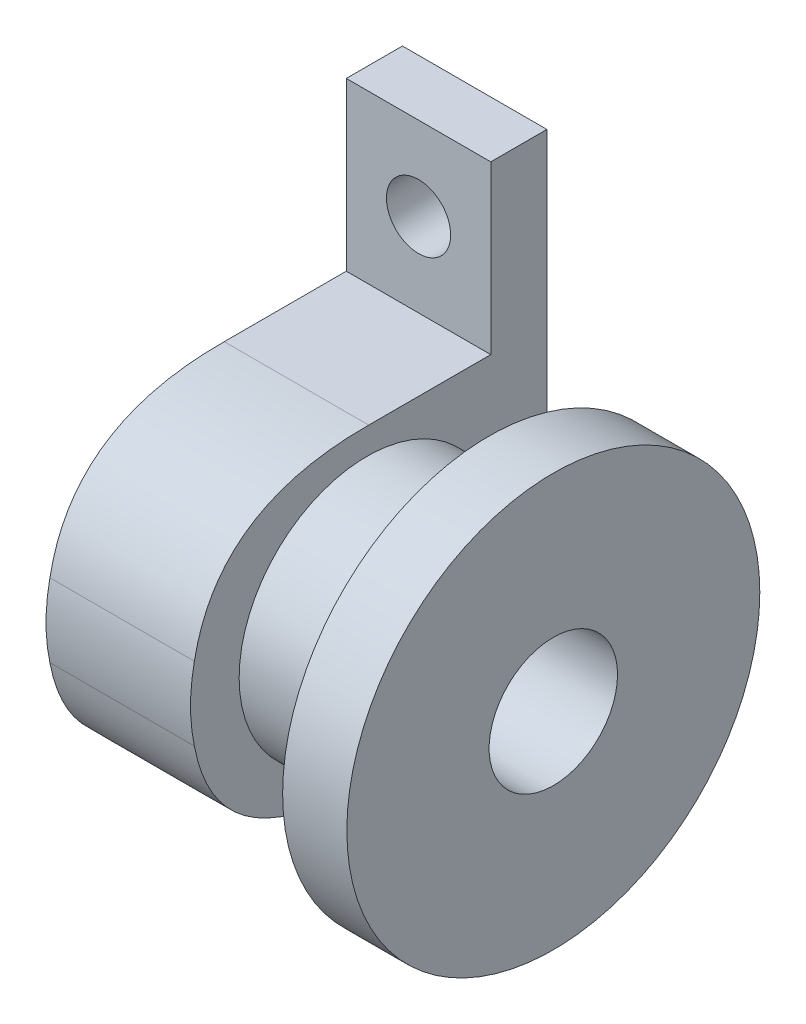
ISO-10303-21;
HEADER;
FILE_DESCRIPTION(('STEP AP214'),'2;1');
FILE_NAME('part.step','',(''),(''),'','','');
FILE_SCHEMA(('AUTOMOTIVE_DESIGN { 1 0 10303 214 1 1 1 1 }'));
ENDSEC;
DATA;
#1=APPLICATION_CONTEXT('core data for automotive mechanical design processes');
#2=APPLICATION_PROTOCOL_DEFINITION('international standard','automotive_design',2000,#1);
#3=PRODUCT_CONTEXT('',#1,'mechanical');
#4=PRODUCT('Part','Part','',(#3));
#5=PRODUCT_RELATED_PRODUCT_CATEGORY('part','',(#4));
#6=PRODUCT_DEFINITION_FORMATION('','',#4);
#7=PRODUCT_DEFINITION_CONTEXT('part definition',#1,'design');
#8=PRODUCT_DEFINITION('design','',#6,#7);
#9=PRODUCT_DEFINITION_SHAPE('','',#8);
#10=(LENGTH_UNIT() NAMED_UNIT(*) SI_UNIT(.MILLI.,.METRE.));
#11=(NAMED_UNIT(*) PLANE_ANGLE_UNIT() SI_UNIT($,.RADIAN.));
#12=(NAMED_UNIT(*) SI_UNIT($,.STERADIAN.) SOLID_ANGLE_UNIT());
#13=UNCERTAINTY_MEASURE_WITH_UNIT(LENGTH_MEASURE(1.E-05),#10,'distance_accuracy_value','');
#14=(GEOMETRIC_REPRESENTATION_CONTEXT(3) GLOBAL_UNCERTAINTY_ASSIGNED_CONTEXT((#13)) GLOBAL_UNIT_ASSIGNED_CONTEXT((#10,
#11,#12)) REPRESENTATION_CONTEXT('',''));
#15=CARTESIAN_POINT('',(0.,0.,0.));
#16=DIRECTION('',(0.,0.,1.));
#17=DIRECTION('',(1.,0.,0.));
#18=AXIS2_PLACEMENT_3D('',#15,#16,#17);
#19=CARTESIAN_POINT('',(0.,-50.,55.5));
#20=DIRECTION('',(1.,0.,0.));
#21=DIRECTION('',(0.,0.,-1.));
#22=AXIS2_PLACEMENT_3D('',#19,#20,#21);
#23=PLANE('',#22);
#24=CARTESIAN_POINT('',(0.,0.,28.));
#25=DIRECTION('',(1.,0.,0.));
#26=DIRECTION('',(0.,0.,-1.));
#27=AXIS2_PLACEMENT_3D('',#24,#25,#26);
#28=CIRCLE('',#27,12.);
#29=CARTESIAN_POINT('',(0.,0.,16.));
#30=VERTEX_POINT('',#29);
#31=EDGE_CURVE('E149',#30,#30,#28,.F.);
#32=ORIENTED_EDGE('',*,*,#31,.F.);
#33=EDGE_LOOP('',(#32));
#34=FACE_BOUND('',#33,.T.);
#35=DIRECTION('',(0.,-1.,0.));
#36=VECTOR('',#35,1.);
#37=CARTESIAN_POINT('',(0.,0.,8.7420219719353));
#38=LINE('',#37,#36);
#39=CARTESIAN_POINT('',(0.,-24.,8.7420219719353));
#40=VERTEX_POINT('',#39);
#41=CARTESIAN_POINT('',(0.,-50.,8.7420219719353));
#42=VERTEX_POINT('',#41);
#43=EDGE_CURVE('E239',#40,#42,#38,.T.);
#44=ORIENTED_EDGE('',*,*,#43,.F.);
#45=DIRECTION('',(0.,0.,1.));
#46=VECTOR('',#45,1.);
#47=CARTESIAN_POINT('',(0.,-24.,0.));
#48=LINE('',#47,#46);
#49=CARTESIAN_POINT('',(0.,-24.,27.75));
#50=VERTEX_POINT('',#49);
#51=EDGE_CURVE('E240',#40,#50,#48,.T.);
#52=ORIENTED_EDGE('',*,*,#51,.T.);
#53=CARTESIAN_POINT('',(0.,0.,55.5));
#54=CARTESIAN_POINT('',(0.,-24.2004229019263,54.7772443116088));
#55=CARTESIAN_POINT('',(0.,-24.,27.75));
#56=B_SPLINE_CURVE_WITH_KNOTS('',2,(#53,#54,#55),.UNSPECIFIED.,.F.,.F.,(3,3),(0.,1.),.UNSPECIFIED.);
#57=CARTESIAN_POINT('',(0.,-5.7193299361362,54.898685192433));
#58=VERTEX_POINT('',#57);
#59=EDGE_CURVE('E227',#58,#50,#56,.T.);
#60=ORIENTED_EDGE('',*,*,#59,.F.);
#61=CARTESIAN_POINT('',(0.,0.,28.));
#62=DIRECTION('',(1.,0.,0.));
#63=DIRECTION('',(0.,0.,-1.));
#64=AXIS2_PLACEMENT_3D('',#61,#62,#63);
#65=CIRCLE('',#64,27.5);
#66=CARTESIAN_POINT('',(0.,5.71932993613605,54.8986851924331));
#67=VERTEX_POINT('',#66);
#68=EDGE_CURVE('E300',#67,#58,#65,.T.);
#69=ORIENTED_EDGE('',*,*,#68,.F.);
#70=CARTESIAN_POINT('',(0.,0.,55.5));
#71=CARTESIAN_POINT('',(0.,24.2004229019263,54.7772443116088));
#72=CARTESIAN_POINT('',(0.,24.,27.75));
#73=B_SPLINE_CURVE_WITH_KNOTS('',2,(#70,#71,#72),.UNSPECIFIED.,.F.,.F.,(3,3),(0.,1.),.UNSPECIFIED.);
#74=CARTESIAN_POINT('',(0.,24.,27.75));
#75=VERTEX_POINT('',#74);
#76=EDGE_CURVE('E292',#67,#75,#73,.T.);
#77=ORIENTED_EDGE('',*,*,#76,.T.);
#78=DIRECTION('',(0.,0.,1.));
#79=VECTOR('',#78,1.);
#80=CARTESIAN_POINT('',(0.,24.,0.));
#81=LINE('',#80,#79);
#82=CARTESIAN_POINT('',(0.,24.,8.7420219719353));
#83=VERTEX_POINT('',#82);
#84=EDGE_CURVE('E301',#83,#75,#81,.T.);
#85=ORIENTED_EDGE('',*,*,#84,.F.);
#86=DIRECTION('',(0.,1.,0.));
#87=VECTOR('',#86,1.);
#88=CARTESIAN_POINT('',(0.,0.,8.7420219719353));
#89=LINE('',#88,#87);
#90=CARTESIAN_POINT('',(0.,50.,8.7420219719353));
#91=VERTEX_POINT('',#90);
#92=EDGE_CURVE('E399',#83,#91,#89,.T.);
#93=ORIENTED_EDGE('',*,*,#92,.T.);
#94=DIRECTION('',(0.,0.,-1.));
#95=VECTOR('',#94,1.);
#96=CARTESIAN_POINT('',(0.,50.,55.5));
#97=LINE('',#96,#95);
#98=CARTESIAN_POINT('',(0.,50.,0.));
#99=VERTEX_POINT('',#98);
#100=EDGE_CURVE('E329',#91,#99,#97,.T.);
#101=ORIENTED_EDGE('',*,*,#100,.T.);
#102=DIRECTION('',(0.,-1.,0.));
#103=VECTOR('',#102,1.);
#104=CARTESIAN_POINT('',(0.,-50.,0.));
#105=LINE('',#104,#103);
#106=CARTESIAN_POINT('',(0.,-50.,0.));
#107=VERTEX_POINT('',#106);
#108=EDGE_CURVE('E312',#99,#107,#105,.T.);
#109=ORIENTED_EDGE('',*,*,#108,.T.);
#110=DIRECTION('',(0.,0.,-1.));
#111=VECTOR('',#110,1.);
#112=CARTESIAN_POINT('',(0.,-50.,55.5));
#113=LINE('',#112,#111);
#114=EDGE_CURVE('E327',#42,#107,#113,.T.);
#115=ORIENTED_EDGE('',*,*,#114,.F.);
#116=EDGE_LOOP('',(#44,#52,#60,#69,#77,#85,#93,#101,#109,#115));
#117=FACE_BOUND('',#116,.T.);
#118=ADVANCED_FACE('F145',(#34,#117),#23,.F.);
#119=CARTESIAN_POINT('',(22.5,-50.,55.5));
#120=DIRECTION('',(-1.,0.,0.));
#121=DIRECTION('',(0.,0.,1.));
#122=AXIS2_PLACEMENT_3D('',#119,#120,#121);
#123=PLANE('',#122);
#124=CARTESIAN_POINT('',(22.5,0.,28.));
#125=DIRECTION('',(1.,0.,0.));
#126=DIRECTION('',(0.,0.,-1.));
#127=AXIS2_PLACEMENT_3D('',#124,#125,#126);
#128=CIRCLE('',#127,19.9273838433925);
#129=CARTESIAN_POINT('',(22.5,0.,8.0726161566075));
#130=VERTEX_POINT('',#129);
#131=EDGE_CURVE('E12',#130,#130,#128,.T.);
#132=ORIENTED_EDGE('',*,*,#131,.F.);
#133=EDGE_LOOP('',(#132));
#134=FACE_BOUND('',#133,.T.);
#135=DIRECTION('',(0.,-1.,0.));
#136=VECTOR('',#135,1.);
#137=CARTESIAN_POINT('',(22.5,0.,8.7420219719353));
#138=LINE('',#137,#136);
#139=CARTESIAN_POINT('',(22.5,-24.,8.7420219719353));
#140=VERTEX_POINT('',#139);
#141=CARTESIAN_POINT('',(22.5,-50.,8.7420219719353));
#142=VERTEX_POINT('',#141);
#143=EDGE_CURVE('E253',#140,#142,#138,.T.);
#144=ORIENTED_EDGE('',*,*,#143,.T.);
#145=DIRECTION('',(0.,0.,-1.));
#146=VECTOR('',#145,1.);
#147=CARTESIAN_POINT('',(22.5,-50.,55.5));
#148=LINE('',#147,#146);
#149=CARTESIAN_POINT('',(22.5,-50.,0.));
#150=VERTEX_POINT('',#149);
#151=EDGE_CURVE('E169',#142,#150,#148,.T.);
#152=ORIENTED_EDGE('',*,*,#151,.T.);
#153=DIRECTION('',(0.,1.,0.));
#154=VECTOR('',#153,1.);
#155=CARTESIAN_POINT('',(22.5,-50.,0.));
#156=LINE('',#155,#154);
#157=CARTESIAN_POINT('',(22.5,50.,0.));
#158=VERTEX_POINT('',#157);
#159=EDGE_CURVE('E320',#150,#158,#156,.T.);
#160=ORIENTED_EDGE('',*,*,#159,.T.);
#161=DIRECTION('',(0.,0.,-1.));
#162=VECTOR('',#161,1.);
#163=CARTESIAN_POINT('',(22.5,50.,55.5));
#164=LINE('',#163,#162);
#165=CARTESIAN_POINT('',(22.5,50.,8.7420219719353));
#166=VERTEX_POINT('',#165);
#167=EDGE_CURVE('E162',#166,#158,#164,.T.);
#168=ORIENTED_EDGE('',*,*,#167,.F.);
#169=DIRECTION('',(0.,1.,0.));
#170=VECTOR('',#169,1.);
#171=CARTESIAN_POINT('',(22.5,0.,8.7420219719353));
#172=LINE('',#171,#170);
#173=CARTESIAN_POINT('',(22.5,24.,8.7420219719353));
#174=VERTEX_POINT('',#173);
#175=EDGE_CURVE('E308',#174,#166,#172,.T.);
#176=ORIENTED_EDGE('',*,*,#175,.F.);
#177=DIRECTION('',(0.,0.,1.));
#178=VECTOR('',#177,1.);
#179=CARTESIAN_POINT('',(22.5,24.,0.));
#180=LINE('',#179,#178);
#181=CARTESIAN_POINT('',(22.5,24.,27.75));
#182=VERTEX_POINT('',#181);
#183=EDGE_CURVE('E376',#174,#182,#180,.T.);
#184=ORIENTED_EDGE('',*,*,#183,.T.);
#185=CARTESIAN_POINT('',(22.5,0.,55.5));
#186=CARTESIAN_POINT('',(22.5,24.2004229019263,54.7772443116088));
#187=CARTESIAN_POINT('',(22.5,24.,27.75));
#188=B_SPLINE_CURVE_WITH_KNOTS('',2,(#185,#186,#187),.UNSPECIFIED.,.F.,.F.,(3,3),(0.,1.),.UNSPECIFIED.);
#189=CARTESIAN_POINT('',(22.5,5.71932993613605,54.8986851924331));
#190=VERTEX_POINT('',#189);
#191=EDGE_CURVE('E407',#190,#182,#188,.T.);
#192=ORIENTED_EDGE('',*,*,#191,.F.);
#193=CARTESIAN_POINT('',(22.5,0.,28.));
#194=DIRECTION('',(1.,0.,0.));
#195=DIRECTION('',(0.,0.,-1.));
#196=AXIS2_PLACEMENT_3D('',#193,#194,#195);
#197=CIRCLE('',#196,27.5);
#198=CARTESIAN_POINT('',(22.5,-5.7193299361362,54.898685192433));
#199=VERTEX_POINT('',#198);
#200=EDGE_CURVE('E313',#190,#199,#197,.T.);
#201=ORIENTED_EDGE('',*,*,#200,.T.);
#202=CARTESIAN_POINT('',(22.5,0.,55.5));
#203=CARTESIAN_POINT('',(22.5,-24.2004229019263,54.7772443116088));
#204=CARTESIAN_POINT('',(22.5,-24.,27.75));
#205=B_SPLINE_CURVE_WITH_KNOTS('',2,(#202,#203,#204),.UNSPECIFIED.,.F.,.F.,(3,3),(0.,1.),.UNSPECIFIED.);
#206=CARTESIAN_POINT('',(22.5,-24.,27.75));
#207=VERTEX_POINT('',#206);
#208=EDGE_CURVE('E256',#199,#207,#205,.T.);
#209=ORIENTED_EDGE('',*,*,#208,.T.);
#210=DIRECTION('',(0.,0.,1.));
#211=VECTOR('',#210,1.);
#212=CARTESIAN_POINT('',(22.5,-24.,0.));
#213=LINE('',#212,#211);
#214=EDGE_CURVE('E247',#140,#207,#213,.T.);
#215=ORIENTED_EDGE('',*,*,#214,.F.);
#216=EDGE_LOOP('',(#144,#152,#160,#168,#176,#184,#192,#201,#209,#215));
#217=FACE_BOUND('',#216,.T.);
#218=ADVANCED_FACE('F341',(#134,#217),#123,.F.);
#219=CARTESIAN_POINT('',(0.,-50.,55.5));
#220=DIRECTION('',(0.,1.,0.));
#221=DIRECTION('',(0.,0.,1.));
#222=AXIS2_PLACEMENT_3D('',#219,#220,#221);
#223=PLANE('',#222);
#224=DIRECTION('',(1.,0.,0.));
#225=VECTOR('',#224,1.);
#226=CARTESIAN_POINT('',(0.,-50.,8.7420219719353));
#227=LINE('',#226,#225);
#228=EDGE_CURVE('E386',#42,#142,#227,.T.);
#229=ORIENTED_EDGE('',*,*,#228,.F.);
#230=ORIENTED_EDGE('',*,*,#114,.T.);
#231=DIRECTION('',(1.,0.,0.));
#232=VECTOR('',#231,1.);
#233=CARTESIAN_POINT('',(0.,-50.,0.));
#234=LINE('',#233,#232);
#235=EDGE_CURVE('E317',#107,#150,#234,.T.);
#236=ORIENTED_EDGE('',*,*,#235,.T.);
#237=ORIENTED_EDGE('',*,*,#151,.F.);
#238=EDGE_LOOP('',(#229,#230,#236,#237));
#239=FACE_BOUND('',#238,.T.);
#240=ADVANCED_FACE('F347',(#239),#223,.F.);
#241=CARTESIAN_POINT('',(22.5,50.,55.5));
#242=DIRECTION('',(0.,-1.,0.));
#243=DIRECTION('',(0.,0.,-1.));
#244=AXIS2_PLACEMENT_3D('',#241,#242,#243);
#245=PLANE('',#244);
#246=ORIENTED_EDGE('',*,*,#100,.F.);
#247=DIRECTION('',(1.,0.,0.));
#248=VECTOR('',#247,1.);
#249=CARTESIAN_POINT('',(0.,50.,8.7420219719353));
#250=LINE('',#249,#248);
#251=EDGE_CURVE('E371',#91,#166,#250,.T.);
#252=ORIENTED_EDGE('',*,*,#251,.T.);
#253=ORIENTED_EDGE('',*,*,#167,.T.);
#254=DIRECTION('',(-1.,0.,0.));
#255=VECTOR('',#254,1.);
#256=CARTESIAN_POINT('',(22.5,50.,0.));
#257=LINE('',#256,#255);
#258=EDGE_CURVE('E309',#158,#99,#257,.T.);
#259=ORIENTED_EDGE('',*,*,#258,.T.);
#260=EDGE_LOOP('',(#246,#252,#253,#259));
#261=FACE_BOUND('',#260,.T.);
#262=ADVANCED_FACE('F147',(#261),#245,.F.);
#263=CARTESIAN_POINT('',(0.,0.,0.));
#264=DIRECTION('',(0.,0.,-1.));
#265=DIRECTION('',(-1.,0.,0.));
#266=AXIS2_PLACEMENT_3D('',#263,#264,#265);
#267=PLANE('',#266);
#268=CARTESIAN_POINT('',(11.25,-37.,0.));
#269=DIRECTION('',(0.,0.,1.));
#270=DIRECTION('',(1.,0.,0.));
#271=AXIS2_PLACEMENT_3D('',#268,#269,#270);
#272=CIRCLE('',#271,4.99843798812871);
#273=CARTESIAN_POINT('',(16.2484379881287,-37.,0.));
#274=VERTEX_POINT('',#273);
#275=EDGE_CURVE('E438',#274,#274,#272,.T.);
#276=ORIENTED_EDGE('',*,*,#275,.T.);
#277=EDGE_LOOP('',(#276));
#278=FACE_BOUND('',#277,.T.);
#279=CARTESIAN_POINT('',(11.25,37.,0.));
#280=DIRECTION('',(0.,0.,1.));
#281=DIRECTION('',(1.,0.,0.));
#282=AXIS2_PLACEMENT_3D('',#279,#280,#281);
#283=CIRCLE('',#282,5.);
#284=CARTESIAN_POINT('',(16.25,37.,0.));
#285=VERTEX_POINT('',#284);
#286=EDGE_CURVE('E427',#285,#285,#283,.T.);
#287=ORIENTED_EDGE('',*,*,#286,.T.);
#288=EDGE_LOOP('',(#287));
#289=FACE_BOUND('',#288,.T.);
#290=ORIENTED_EDGE('',*,*,#258,.F.);
#291=ORIENTED_EDGE('',*,*,#159,.F.);
#292=ORIENTED_EDGE('',*,*,#235,.F.);
#293=ORIENTED_EDGE('',*,*,#108,.F.);
#294=EDGE_LOOP('',(#290,#291,#292,#293));
#295=FACE_BOUND('',#294,.T.);
#296=ADVANCED_FACE('F283',(#278,#289,#295),#267,.T.);
#297=CARTESIAN_POINT('',(0.,0.,28.));
#298=DIRECTION('',(1.,0.,0.));
#299=DIRECTION('',(0.,0.,-1.));
#300=AXIS2_PLACEMENT_3D('',#297,#298,#299);
#301=CYLINDRICAL_SURFACE('',#300,27.5);
#302=ORIENTED_EDGE('',*,*,#200,.F.);
#303=DIRECTION('',(1.,0.,0.));
#304=VECTOR('',#303,1.);
#305=CARTESIAN_POINT('',(0.,5.71932993613605,54.8986851924331));
#306=LINE('',#305,#304);
#307=EDGE_CURVE('E396',#67,#190,#306,.T.);
#308=ORIENTED_EDGE('',*,*,#307,.F.);
#309=ORIENTED_EDGE('',*,*,#68,.T.);
#310=DIRECTION('',(1.,0.,0.));
#311=VECTOR('',#310,1.);
#312=CARTESIAN_POINT('',(0.,-5.7193299361362,54.898685192433));
#313=LINE('',#312,#311);
#314=EDGE_CURVE('E234',#58,#199,#313,.T.);
#315=ORIENTED_EDGE('',*,*,#314,.T.);
#316=EDGE_LOOP('',(#302,#308,#309,#315));
#317=FACE_BOUND('',#316,.T.);
#318=ADVANCED_FACE('F279',(#317),#301,.T.);
#319=CARTESIAN_POINT('',(0.,0.,8.7420219719353));
#320=DIRECTION('',(0.,0.,-1.));
#321=DIRECTION('',(0.,1.,0.));
#322=AXIS2_PLACEMENT_3D('',#319,#320,#321);
#323=PLANE('',#322);
#324=CARTESIAN_POINT('',(11.25,37.,8.7420219719353));
#325=DIRECTION('',(0.,0.,1.));
#326=DIRECTION('',(1.,0.,0.));
#327=AXIS2_PLACEMENT_3D('',#324,#325,#326);
#328=CIRCLE('',#327,5.);
#329=CARTESIAN_POINT('',(16.25,37.,8.7420219719353));
#330=VERTEX_POINT('',#329);
#331=EDGE_CURVE('E259',#330,#330,#328,.T.);
#332=ORIENTED_EDGE('',*,*,#331,.F.);
#333=EDGE_LOOP('',(#332));
#334=FACE_BOUND('',#333,.T.);
#335=ORIENTED_EDGE('',*,*,#175,.T.);
#336=ORIENTED_EDGE('',*,*,#251,.F.);
#337=ORIENTED_EDGE('',*,*,#92,.F.);
#338=DIRECTION('',(1.,0.,0.));
#339=VECTOR('',#338,1.);
#340=CARTESIAN_POINT('',(0.,24.,8.7420219719353));
#341=LINE('',#340,#339);
#342=EDGE_CURVE('E372',#83,#174,#341,.T.);
#343=ORIENTED_EDGE('',*,*,#342,.T.);
#344=EDGE_LOOP('',(#335,#336,#337,#343));
#345=FACE_BOUND('',#344,.T.);
#346=ADVANCED_FACE('F282',(#334,#345),#323,.F.);
#347=CARTESIAN_POINT('',(0.,24.,0.));
#348=DIRECTION('',(0.,1.,0.));
#349=DIRECTION('',(0.,0.,1.));
#350=AXIS2_PLACEMENT_3D('',#347,#348,#349);
#351=PLANE('',#350);
#352=ORIENTED_EDGE('',*,*,#183,.F.);
#353=ORIENTED_EDGE('',*,*,#342,.F.);
#354=ORIENTED_EDGE('',*,*,#84,.T.);
#355=DIRECTION('',(1.,0.,0.));
#356=VECTOR('',#355,1.);
#357=CARTESIAN_POINT('',(0.,24.,27.75));
#358=LINE('',#357,#356);
#359=EDGE_CURVE('E400',#75,#182,#358,.T.);
#360=ORIENTED_EDGE('',*,*,#359,.T.);
#361=EDGE_LOOP('',(#352,#353,#354,#360));
#362=FACE_BOUND('',#361,.T.);
#363=ADVANCED_FACE('F289',(#362),#351,.T.);
#364=DIRECTION('',(1.,0.,0.));
#365=VECTOR('',#364,1.);
#366=SURFACE_OF_LINEAR_EXTRUSION('',#73,#365);
#367=ORIENTED_EDGE('',*,*,#191,.T.);
#368=ORIENTED_EDGE('',*,*,#359,.F.);
#369=ORIENTED_EDGE('',*,*,#76,.F.);
#370=ORIENTED_EDGE('',*,*,#307,.T.);
#371=EDGE_LOOP('',(#367,#368,#369,#370));
#372=FACE_BOUND('',#371,.T.);
#373=ADVANCED_FACE('F285',(#372),#366,.F.);
#374=CARTESIAN_POINT('',(0.,0.,28.));
#375=DIRECTION('',(1.,0.,0.));
#376=DIRECTION('',(0.,0.,-1.));
#377=AXIS2_PLACEMENT_3D('',#374,#375,#376);
#378=CYLINDRICAL_SURFACE('',#377,10.);
#379=CARTESIAN_POINT('',(-5.,0.,28.));
#380=DIRECTION('',(-1.,0.,0.));
#381=DIRECTION('',(0.,0.,1.));
#382=AXIS2_PLACEMENT_3D('',#379,#380,#381);
#383=CIRCLE('',#382,10.);
#384=CARTESIAN_POINT('',(-5.,0.,18.));
#385=VERTEX_POINT('',#384);
#386=EDGE_CURVE('E451',#385,#385,#383,.F.);
#387=CARTESIAN_POINT('',(51.5,0.,28.));
#388=DIRECTION('',(1.,0.,0.));
#389=DIRECTION('',(0.,0.,-1.));
#390=AXIS2_PLACEMENT_3D('',#387,#388,#389);
#391=CIRCLE('',#390,10.);
#392=CARTESIAN_POINT('',(51.5,0.,18.));
#393=VERTEX_POINT('',#392);
#394=EDGE_CURVE('E464',#393,#393,#391,.T.);
#395=CARTESIAN_POINT('',(-5.,0.,18.));
#396=CARTESIAN_POINT('',(-4.41145833333333,0.,18.));
#397=CARTESIAN_POINT('',(-3.82291666666667,0.,18.));
#398=CARTESIAN_POINT('',(-2.64583333333333,0.,18.));
#399=CARTESIAN_POINT('',(-2.05729166666667,0.,18.));
#400=CARTESIAN_POINT('',(-0.880208333333333,0.,18.));
#401=CARTESIAN_POINT('',(-0.291666666666666,0.,18.));
#402=CARTESIAN_POINT('',(0.885416666666667,0.,18.));
#403=CARTESIAN_POINT('',(1.47395833333333,0.,18.));
#404=CARTESIAN_POINT('',(2.65104166666667,0.,18.));
#405=CARTESIAN_POINT('',(3.23958333333333,0.,18.));
#406=CARTESIAN_POINT('',(4.41666666666667,0.,18.));
#407=CARTESIAN_POINT('',(5.00520833333333,0.,18.));
#408=CARTESIAN_POINT('',(6.18229166666667,0.,18.));
#409=CARTESIAN_POINT('',(6.77083333333333,0.,18.));
#410=CARTESIAN_POINT('',(7.94791666666667,0.,18.));
#411=CARTESIAN_POINT('',(8.53645833333333,0.,18.));
#412=CARTESIAN_POINT('',(9.71354166666667,0.,18.));
#413=CARTESIAN_POINT('',(10.3020833333333,0.,18.));
#414=CARTESIAN_POINT('',(11.4791666666667,0.,18.));
#415=CARTESIAN_POINT('',(12.0677083333333,0.,18.));
#416=CARTESIAN_POINT('',(13.2447916666667,0.,18.));
#417=CARTESIAN_POINT('',(13.8333333333333,0.,18.));
#418=CARTESIAN_POINT('',(15.0104166666667,0.,18.));
#419=CARTESIAN_POINT('',(15.5989583333333,0.,18.));
#420=CARTESIAN_POINT('',(16.7760416666667,0.,18.));
#421=CARTESIAN_POINT('',(17.3645833333333,0.,18.));
#422=CARTESIAN_POINT('',(18.5416666666667,0.,18.));
#423=CARTESIAN_POINT('',(19.1302083333333,0.,18.));
#424=CARTESIAN_POINT('',(20.3072916666667,0.,18.));
#425=CARTESIAN_POINT('',(20.8958333333333,0.,18.));
#426=CARTESIAN_POINT('',(22.0729166666667,0.,18.));
#427=CARTESIAN_POINT('',(22.6614583333333,0.,18.));
#428=CARTESIAN_POINT('',(23.8385416666667,0.,18.));
#429=CARTESIAN_POINT('',(24.4270833333333,0.,18.));
#430=CARTESIAN_POINT('',(25.6041666666667,0.,18.));
#431=CARTESIAN_POINT('',(26.1927083333333,0.,18.));
#432=CARTESIAN_POINT('',(27.3697916666667,0.,18.));
#433=CARTESIAN_POINT('',(27.9583333333333,0.,18.));
#434=CARTESIAN_POINT('',(29.1354166666667,0.,18.));
#435=CARTESIAN_POINT('',(29.7239583333333,0.,18.));
#436=CARTESIAN_POINT('',(30.9010416666667,0.,18.));
#437=CARTESIAN_POINT('',(31.4895833333333,0.,18.));
#438=CARTESIAN_POINT('',(32.6666666666667,0.,18.));
#439=CARTESIAN_POINT('',(33.2552083333333,0.,18.));
#440=CARTESIAN_POINT('',(34.4322916666667,0.,18.));
#441=CARTESIAN_POINT('',(35.0208333333333,0.,18.));
#442=CARTESIAN_POINT('',(36.1979166666667,0.,18.));
#443=CARTESIAN_POINT('',(36.7864583333333,0.,18.));
#444=CARTESIAN_POINT('',(37.9635416666667,0.,18.));
#445=CARTESIAN_POINT('',(38.5520833333333,0.,18.));
#446=CARTESIAN_POINT('',(39.7291666666667,0.,18.));
#447=CARTESIAN_POINT('',(40.3177083333333,0.,18.));
#448=CARTESIAN_POINT('',(41.4947916666667,0.,18.));
#449=CARTESIAN_POINT('',(42.0833333333333,0.,18.));
#450=CARTESIAN_POINT('',(43.2604166666667,0.,18.));
#451=CARTESIAN_POINT('',(43.8489583333333,0.,18.));
#452=CARTESIAN_POINT('',(45.0260416666667,0.,18.));
#453=CARTESIAN_POINT('',(45.6145833333333,0.,18.));
#454=CARTESIAN_POINT('',(46.7916666666667,0.,18.));
#455=CARTESIAN_POINT('',(47.3802083333333,0.,18.));
#456=CARTESIAN_POINT('',(48.5572916666667,0.,18.));
#457=CARTESIAN_POINT('',(49.1458333333333,0.,18.));
#458=CARTESIAN_POINT('',(50.3229166666667,0.,18.));
#459=CARTESIAN_POINT('',(50.9114583333333,0.,18.));
#460=CARTESIAN_POINT('',(51.5,0.,18.));
#461=B_SPLINE_CURVE_WITH_KNOTS('',3,(#395,#396,#397,#398,#399,#400,#401,#402,#403,#404,#405,
#406,#407,#408,#409,#410,#411,#412,#413,#414,#415,#416,#417,#418,#419,#420,#421,#422,#423,#424,
#425,#426,#427,#428,#429,#430,#431,#432,#433,#434,#435,#436,#437,#438,#439,#440,#441,#442,#443,
#444,#445,#446,#447,#448,#449,#450,#451,#452,#453,#454,#455,#456,#457,#458,#459,#460),
.UNSPECIFIED.,.F.,.F.,(4,2,2,2,2,2,2,2,2,2,2,2,2,2,2,2,2,2,2,2,2,2,2,2,2,2,2,2,2,2,2,2,4),(0.,
1.765625,3.53125,5.296875,7.0625,8.828125,10.59375,12.359375,14.125,15.890625,17.65625,
19.421875,21.1875,22.953125,24.71875,26.484375,28.25,30.015625,31.78125,33.546875,35.3125,
37.078125,38.84375,40.609375,42.375,44.140625,45.90625,47.671875,49.4375,51.203125,52.96875,
54.734375,56.5),.UNSPECIFIED.);
#462=EDGE_CURVE('BSEAM278',#385,#393,#461,.T.);
#463=ORIENTED_EDGE('',*,*,#386,.F.);
#464=ORIENTED_EDGE('',*,*,#394,.T.);
#465=ORIENTED_EDGE('',*,*,#462,.T.);
#466=ORIENTED_EDGE('',*,*,#462,.F.);
#467=EDGE_LOOP('',(#463,#465,#464,#466));
#468=FACE_BOUND('',#467,.T.);
#469=ADVANCED_FACE('F278',(#468),#378,.F.);
#470=CARTESIAN_POINT('',(0.,-24.,0.));
#471=DIRECTION('',(0.,1.,0.));
#472=DIRECTION('',(0.,0.,1.));
#473=AXIS2_PLACEMENT_3D('',#470,#471,#472);
#474=PLANE('',#473);
#475=ORIENTED_EDGE('',*,*,#214,.T.);
#476=DIRECTION('',(1.,0.,0.));
#477=VECTOR('',#476,1.);
#478=CARTESIAN_POINT('',(0.,-24.,27.75));
#479=LINE('',#478,#477);
#480=EDGE_CURVE('E231',#50,#207,#479,.T.);
#481=ORIENTED_EDGE('',*,*,#480,.F.);
#482=ORIENTED_EDGE('',*,*,#51,.F.);
#483=DIRECTION('',(1.,0.,0.));
#484=VECTOR('',#483,1.);
#485=CARTESIAN_POINT('',(0.,-24.,8.7420219719353));
#486=LINE('',#485,#484);
#487=EDGE_CURVE('E379',#40,#140,#486,.T.);
#488=ORIENTED_EDGE('',*,*,#487,.T.);
#489=EDGE_LOOP('',(#475,#481,#482,#488));
#490=FACE_BOUND('',#489,.T.);
#491=ADVANCED_FACE('F244',(#490),#474,.F.);
#492=CARTESIAN_POINT('',(0.,0.,8.7420219719353));
#493=DIRECTION('',(0.,0.,1.));
#494=DIRECTION('',(0.,-1.,0.));
#495=AXIS2_PLACEMENT_3D('',#492,#493,#494);
#496=PLANE('',#495);
#497=CARTESIAN_POINT('',(11.25,-37.,8.7420219719353));
#498=DIRECTION('',(0.,0.,1.));
#499=DIRECTION('',(1.,0.,0.));
#500=AXIS2_PLACEMENT_3D('',#497,#498,#499);
#501=CIRCLE('',#500,4.99843798812871);
#502=CARTESIAN_POINT('',(16.2484379881287,-37.,8.7420219719353));
#503=VERTEX_POINT('',#502);
#504=EDGE_CURVE('E440',#503,#503,#501,.T.);
#505=ORIENTED_EDGE('',*,*,#504,.F.);
#506=EDGE_LOOP('',(#505));
#507=FACE_BOUND('',#506,.T.);
#508=ORIENTED_EDGE('',*,*,#143,.F.);
#509=ORIENTED_EDGE('',*,*,#487,.F.);
#510=ORIENTED_EDGE('',*,*,#43,.T.);
#511=ORIENTED_EDGE('',*,*,#228,.T.);
#512=EDGE_LOOP('',(#508,#509,#510,#511));
#513=FACE_BOUND('',#512,.T.);
#514=ADVANCED_FACE('F274',(#507,#513),#496,.T.);
#515=DIRECTION('',(1.,0.,0.));
#516=VECTOR('',#515,1.);
#517=SURFACE_OF_LINEAR_EXTRUSION('',#56,#516);
#518=ORIENTED_EDGE('',*,*,#208,.F.);
#519=ORIENTED_EDGE('',*,*,#314,.F.);
#520=ORIENTED_EDGE('',*,*,#59,.T.);
#521=ORIENTED_EDGE('',*,*,#480,.T.);
#522=EDGE_LOOP('',(#518,#519,#520,#521));
#523=FACE_BOUND('',#522,.T.);
#524=ADVANCED_FACE('F230',(#523),#517,.T.);
#525=CARTESIAN_POINT('',(11.25,37.,0.));
#526=DIRECTION('',(0.,0.,1.));
#527=DIRECTION('',(1.,0.,0.));
#528=AXIS2_PLACEMENT_3D('',#525,#526,#527);
#529=CYLINDRICAL_SURFACE('',#528,5.);
#530=ORIENTED_EDGE('',*,*,#286,.F.);
#531=EDGE_LOOP('',(#530));
#532=FACE_BOUND('',#531,.T.);
#533=ORIENTED_EDGE('',*,*,#331,.T.);
#534=EDGE_LOOP('',(#533));
#535=FACE_BOUND('',#534,.T.);
#536=ADVANCED_FACE('F273',(#532,#535),#529,.F.);
#537=CARTESIAN_POINT('',(11.25,-37.,0.));
#538=DIRECTION('',(0.,0.,1.));
#539=DIRECTION('',(1.,0.,0.));
#540=AXIS2_PLACEMENT_3D('',#537,#538,#539);
#541=CYLINDRICAL_SURFACE('',#540,4.99843798812871);
#542=ORIENTED_EDGE('',*,*,#275,.F.);
#543=EDGE_LOOP('',(#542));
#544=FACE_BOUND('',#543,.T.);
#545=ORIENTED_EDGE('',*,*,#504,.T.);
#546=EDGE_LOOP('',(#545));
#547=FACE_BOUND('',#546,.T.);
#548=ADVANCED_FACE('F497',(#544,#547),#541,.F.);
#549=CARTESIAN_POINT('',(-5.,0.,28.));
#550=DIRECTION('',(1.,0.,0.));
#551=DIRECTION('',(0.,0.,-1.));
#552=AXIS2_PLACEMENT_3D('',#549,#550,#551);
#553=CYLINDRICAL_SURFACE('',#552,12.);
#554=CARTESIAN_POINT('',(-5.,0.,28.));
#555=DIRECTION('',(-1.,0.,0.));
#556=DIRECTION('',(0.,0.,1.));
#557=AXIS2_PLACEMENT_3D('',#554,#555,#556);
#558=CIRCLE('',#557,12.);
#559=CARTESIAN_POINT('',(-5.,0.,40.));
#560=VERTEX_POINT('',#559);
#561=EDGE_CURVE('E444',#560,#560,#558,.T.);
#562=ORIENTED_EDGE('',*,*,#561,.F.);
#563=EDGE_LOOP('',(#562));
#564=FACE_BOUND('',#563,.T.);
#565=ORIENTED_EDGE('',*,*,#31,.T.);
#566=EDGE_LOOP('',(#565));
#567=FACE_BOUND('',#566,.T.);
#568=ADVANCED_FACE('F338',(#564,#567),#553,.T.);
#569=CARTESIAN_POINT('',(-5.,0.,0.));
#570=DIRECTION('',(-1.,0.,0.));
#571=DIRECTION('',(0.,0.,1.));
#572=AXIS2_PLACEMENT_3D('',#569,#570,#571);
#573=PLANE('',#572);
#574=ORIENTED_EDGE('',*,*,#386,.T.);
#575=EDGE_LOOP('',(#574));
#576=FACE_BOUND('',#575,.T.);
#577=ORIENTED_EDGE('',*,*,#561,.T.);
#578=EDGE_LOOP('',(#577));
#579=FACE_BOUND('',#578,.T.);
#580=ADVANCED_FACE('F486',(#576,#579),#573,.T.);
#581=CARTESIAN_POINT('',(41.5,0.,28.));
#582=DIRECTION('',(-1.,0.,0.));
#583=DIRECTION('',(0.,0.,1.));
#584=AXIS2_PLACEMENT_3D('',#581,#582,#583);
#585=CYLINDRICAL_SURFACE('',#584,19.9273838433925);
#586=CARTESIAN_POINT('',(41.5,0.,28.));
#587=DIRECTION('',(1.,0.,0.));
#588=DIRECTION('',(0.,0.,-1.));
#589=AXIS2_PLACEMENT_3D('',#586,#587,#588);
#590=CIRCLE('',#589,19.9273838433925);
#591=CARTESIAN_POINT('',(41.5,0.,8.0726161566075));
#592=VERTEX_POINT('',#591);
#593=EDGE_CURVE('E454',#592,#592,#590,.T.);
#594=ORIENTED_EDGE('',*,*,#593,.F.);
#595=EDGE_LOOP('',(#594));
#596=FACE_BOUND('',#595,.T.);
#597=ORIENTED_EDGE('',*,*,#131,.T.);
#598=EDGE_LOOP('',(#597));
#599=FACE_BOUND('',#598,.T.);
#600=ADVANCED_FACE('F476',(#596,#599),#585,.T.);
#601=CARTESIAN_POINT('',(51.5,0.,28.));
#602=DIRECTION('',(1.,0.,0.));
#603=DIRECTION('',(0.,0.,-1.));
#604=AXIS2_PLACEMENT_3D('',#601,#602,#603);
#605=PLANE('',#604);
#606=CARTESIAN_POINT('',(51.5,0.,28.));
#607=DIRECTION('',(1.,0.,0.));
#608=DIRECTION('',(0.,0.,-1.));
#609=AXIS2_PLACEMENT_3D('',#606,#607,#608);
#610=CIRCLE('',#609,32.1556925671809);
#611=CARTESIAN_POINT('',(51.5,0.,-4.15569256718087));
#612=VERTEX_POINT('',#611);
#613=EDGE_CURVE('E459',#612,#612,#610,.T.);
#614=ORIENTED_EDGE('',*,*,#613,.T.);
#615=EDGE_LOOP('',(#614));
#616=FACE_BOUND('',#615,.T.);
#617=ORIENTED_EDGE('',*,*,#394,.F.);
#618=EDGE_LOOP('',(#617));
#619=FACE_BOUND('',#618,.T.);
#620=ADVANCED_FACE('F473',(#616,#619),#605,.T.);
#621=CARTESIAN_POINT('',(41.5,0.,28.));
#622=DIRECTION('',(1.,0.,0.));
#623=DIRECTION('',(0.,0.,-1.));
#624=AXIS2_PLACEMENT_3D('',#621,#622,#623);
#625=PLANE('',#624);
#626=ORIENTED_EDGE('',*,*,#593,.T.);
#627=EDGE_LOOP('',(#626));
#628=FACE_BOUND('',#627,.T.);
#629=CARTESIAN_POINT('',(41.5,0.,28.));
#630=DIRECTION('',(1.,0.,0.));
#631=DIRECTION('',(0.,0.,-1.));
#632=AXIS2_PLACEMENT_3D('',#629,#630,#631);
#633=CIRCLE('',#632,32.1556925671809);
#634=CARTESIAN_POINT('',(41.5,0.,-4.15569256718087));
#635=VERTEX_POINT('',#634);
#636=EDGE_CURVE('E460',#635,#635,#633,.T.);
#637=ORIENTED_EDGE('',*,*,#636,.F.);
#638=EDGE_LOOP('',(#637));
#639=FACE_BOUND('',#638,.T.);
#640=ADVANCED_FACE('F475',(#628,#639),#625,.F.);
#641=CARTESIAN_POINT('',(51.5,0.,28.));
#642=DIRECTION('',(-1.,0.,0.));
#643=DIRECTION('',(0.,0.,1.));
#644=AXIS2_PLACEMENT_3D('',#641,#642,#643);
#645=CYLINDRICAL_SURFACE('',#644,32.1556925671809);
#646=ORIENTED_EDGE('',*,*,#613,.F.);
#647=EDGE_LOOP('',(#646));
#648=FACE_BOUND('',#647,.T.);
#649=ORIENTED_EDGE('',*,*,#636,.T.);
#650=EDGE_LOOP('',(#649));
#651=FACE_BOUND('',#650,.T.);
#652=ADVANCED_FACE('F482',(#648,#651),#645,.T.);
#653=CLOSED_SHELL('',(#118,#218,#240,#262,#296,#318,#346,#363,#373,#469,#491,#514,#524,#536,
#548,#568,#580,#600,#620,#640,#652));
#654=MANIFOLD_SOLID_BREP('B2',#653);
#655=ADVANCED_BREP_SHAPE_REPRESENTATION('',(#18,#654),#14);
#656=SHAPE_DEFINITION_REPRESENTATION(#9,#655);
ENDSEC;
END-ISO-10303-21;
